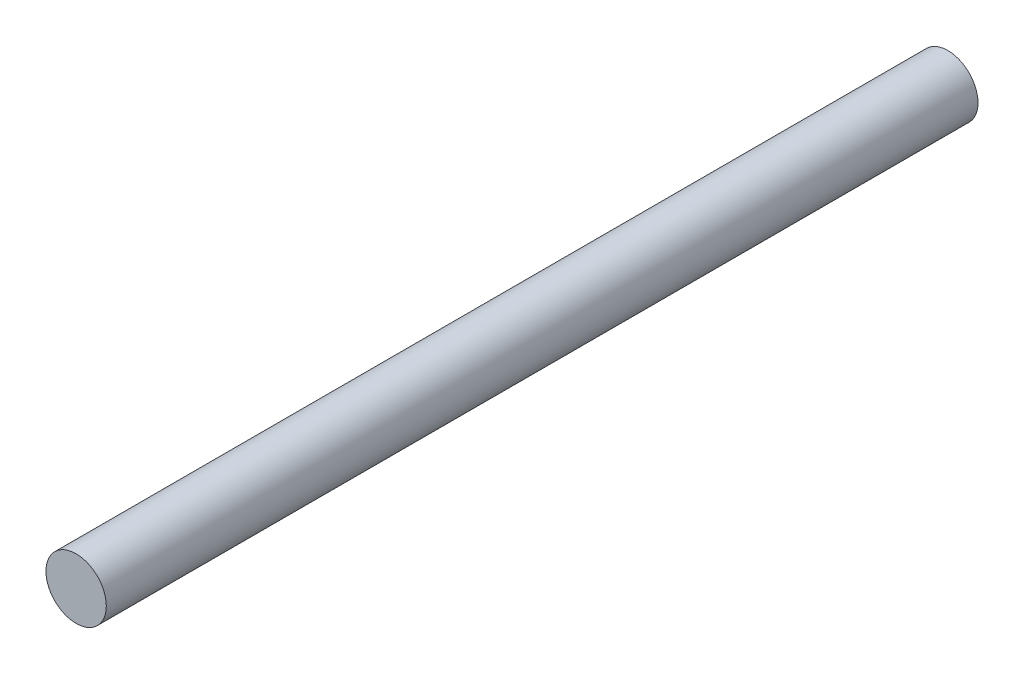
ISO-10303-21;
HEADER;
FILE_DESCRIPTION(('STEP AP214'),'2;1');
FILE_NAME('part.step','',(''),(''),'','','');
FILE_SCHEMA(('AUTOMOTIVE_DESIGN { 1 0 10303 214 1 1 1 1 }'));
ENDSEC;
DATA;
#1=APPLICATION_CONTEXT('core data for automotive mechanical design processes');
#2=APPLICATION_PROTOCOL_DEFINITION('international standard','automotive_design',2000,#1);
#3=PRODUCT_CONTEXT('',#1,'mechanical');
#4=PRODUCT('Part','Part','',(#3));
#5=PRODUCT_RELATED_PRODUCT_CATEGORY('part','',(#4));
#6=PRODUCT_DEFINITION_FORMATION('','',#4);
#7=PRODUCT_DEFINITION_CONTEXT('part definition',#1,'design');
#8=PRODUCT_DEFINITION('design','',#6,#7);
#9=PRODUCT_DEFINITION_SHAPE('','',#8);
#10=(LENGTH_UNIT() NAMED_UNIT(*) SI_UNIT(.MILLI.,.METRE.));
#11=(NAMED_UNIT(*) PLANE_ANGLE_UNIT() SI_UNIT($,.RADIAN.));
#12=(NAMED_UNIT(*) SI_UNIT($,.STERADIAN.) SOLID_ANGLE_UNIT());
#13=UNCERTAINTY_MEASURE_WITH_UNIT(LENGTH_MEASURE(1.E-05),#10,'distance_accuracy_value','');
#14=(GEOMETRIC_REPRESENTATION_CONTEXT(3) GLOBAL_UNCERTAINTY_ASSIGNED_CONTEXT((#13)) GLOBAL_UNIT_ASSIGNED_CONTEXT((#10,
#11,#12)) REPRESENTATION_CONTEXT('',''));
#15=CARTESIAN_POINT('',(0.,0.,0.));
#16=DIRECTION('',(0.,0.,1.));
#17=DIRECTION('',(1.,0.,0.));
#18=AXIS2_PLACEMENT_3D('',#15,#16,#17);
#19=CARTESIAN_POINT('',(0.,0.,65.));
#20=DIRECTION('',(0.,0.,-1.));
#21=DIRECTION('',(-1.,0.,0.));
#22=AXIS2_PLACEMENT_3D('',#19,#20,#21);
#23=CYLINDRICAL_SURFACE('',#22,2.25);
#24=CARTESIAN_POINT('',(0.,0.,65.));
#25=DIRECTION('',(0.,0.,1.));
#26=DIRECTION('',(1.,0.,0.));
#27=AXIS2_PLACEMENT_3D('',#24,#25,#26);
#28=CIRCLE('',#27,2.25);
#29=CARTESIAN_POINT('',(2.25,0.,65.));
#30=VERTEX_POINT('',#29);
#31=EDGE_CURVE('E10',#30,#30,#28,.T.);
#32=ORIENTED_EDGE('',*,*,#31,.F.);
#33=EDGE_LOOP('',(#32));
#34=FACE_BOUND('',#33,.T.);
#35=CARTESIAN_POINT('',(0.,0.,0.));
#36=DIRECTION('',(0.,0.,1.));
#37=DIRECTION('',(1.,0.,0.));
#38=AXIS2_PLACEMENT_3D('',#35,#36,#37);
#39=CIRCLE('',#38,2.25);
#40=CARTESIAN_POINT('',(2.25,0.,0.));
#41=VERTEX_POINT('',#40);
#42=EDGE_CURVE('E40',#41,#41,#39,.T.);
#43=ORIENTED_EDGE('',*,*,#42,.T.);
#44=EDGE_LOOP('',(#43));
#45=FACE_BOUND('',#44,.T.);
#46=ADVANCED_FACE('F37',(#34,#45),#23,.T.);
#47=CARTESIAN_POINT('',(0.,0.,65.));
#48=DIRECTION('',(0.,0.,1.));
#49=DIRECTION('',(1.,0.,0.));
#50=AXIS2_PLACEMENT_3D('',#47,#48,#49);
#51=PLANE('',#50);
#52=ORIENTED_EDGE('',*,*,#31,.T.);
#53=EDGE_LOOP('',(#52));
#54=FACE_BOUND('',#53,.T.);
#55=ADVANCED_FACE('F54',(#54),#51,.T.);
#56=CARTESIAN_POINT('',(0.,0.,0.));
#57=DIRECTION('',(0.,0.,1.));
#58=DIRECTION('',(1.,0.,0.));
#59=AXIS2_PLACEMENT_3D('',#56,#57,#58);
#60=PLANE('',#59);
#61=ORIENTED_EDGE('',*,*,#42,.F.);
#62=EDGE_LOOP('',(#61));
#63=FACE_BOUND('',#62,.T.);
#64=ADVANCED_FACE('F52',(#63),#60,.F.);
#65=CLOSED_SHELL('',(#46,#55,#64));
#66=MANIFOLD_SOLID_BREP('B2',#65);
#67=ADVANCED_BREP_SHAPE_REPRESENTATION('',(#18,#66),#14);
#68=SHAPE_DEFINITION_REPRESENTATION(#9,#67);
ENDSEC;
END-ISO-10303-21;
